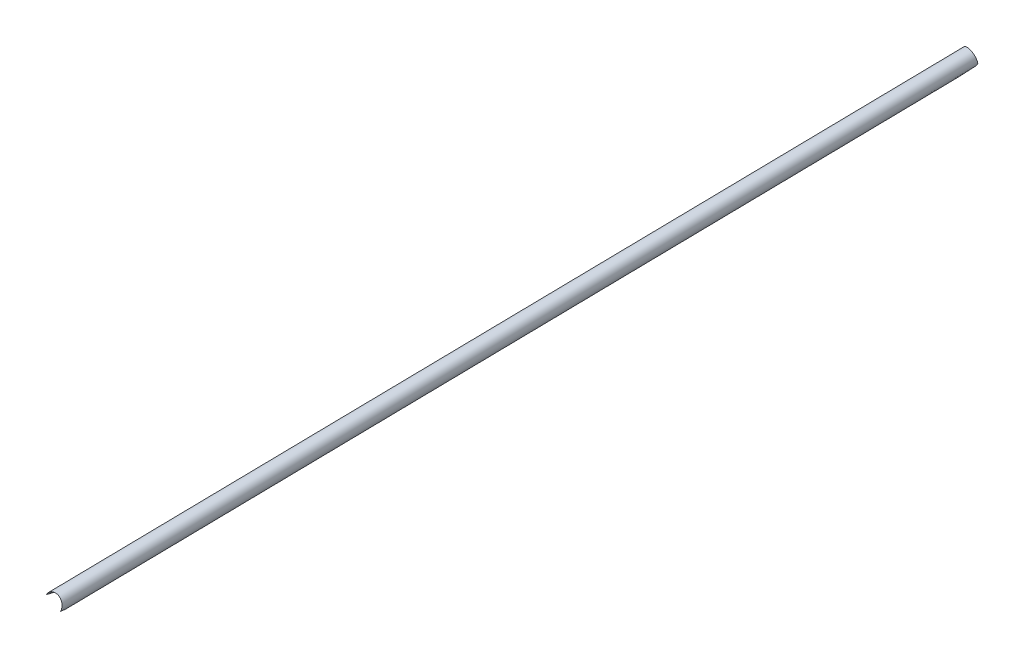
ISO-10303-21;
HEADER;
FILE_DESCRIPTION(('STEP AP214'),'2;1');
FILE_NAME('part.step','',(''),(''),'','','');
FILE_SCHEMA(('AUTOMOTIVE_DESIGN { 1 0 10303 214 1 1 1 1 }'));
ENDSEC;
DATA;
#1=APPLICATION_CONTEXT('core data for automotive mechanical design processes');
#2=APPLICATION_PROTOCOL_DEFINITION('international standard','automotive_design',2000,#1);
#3=PRODUCT_CONTEXT('',#1,'mechanical');
#4=PRODUCT('Part','Part','',(#3));
#5=PRODUCT_RELATED_PRODUCT_CATEGORY('part','',(#4));
#6=PRODUCT_DEFINITION_FORMATION('','',#4);
#7=PRODUCT_DEFINITION_CONTEXT('part definition',#1,'design');
#8=PRODUCT_DEFINITION('design','',#6,#7);
#9=PRODUCT_DEFINITION_SHAPE('','',#8);
#10=(LENGTH_UNIT() NAMED_UNIT(*) SI_UNIT(.MILLI.,.METRE.));
#11=(NAMED_UNIT(*) PLANE_ANGLE_UNIT() SI_UNIT($,.RADIAN.));
#12=(NAMED_UNIT(*) SI_UNIT($,.STERADIAN.) SOLID_ANGLE_UNIT());
#13=UNCERTAINTY_MEASURE_WITH_UNIT(LENGTH_MEASURE(1.E-05),#10,'distance_accuracy_value','');
#14=(GEOMETRIC_REPRESENTATION_CONTEXT(3) GLOBAL_UNCERTAINTY_ASSIGNED_CONTEXT((#13)) GLOBAL_UNIT_ASSIGNED_CONTEXT((#10,
#11,#12)) REPRESENTATION_CONTEXT('',''));
#15=CARTESIAN_POINT('',(0.,0.,0.));
#16=DIRECTION('',(0.,0.,1.));
#17=DIRECTION('',(1.,0.,0.));
#18=AXIS2_PLACEMENT_3D('',#15,#16,#17);
#19=CARTESIAN_POINT('',(325.000000000001,320.,-1580.));
#20=DIRECTION('',(-0.0876619818920292,-0.105194378270435,0.99058039537993));
#21=DIRECTION('',(0.,-0.994408591727349,-0.105600912395825));
#22=AXIS2_PLACEMENT_3D('',#19,#20,#21);
#23=CYLINDRICAL_SURFACE('',#22,9.79999999999998);
#24=CARTESIAN_POINT('',(227.524141759936,193.283765912995,-479.55769082875));
#25=CARTESIAN_POINT('',(227.679775034361,193.261769446244,-479.350571271817));
#26=CARTESIAN_POINT('',(227.829401668831,193.243848711683,-479.138457133615));
#27=CARTESIAN_POINT('',(228.118242825217,193.214861654862,-478.706755033853));
#28=CARTESIAN_POINT('',(228.257452096282,193.203798769096,-478.48716338333));
#29=CARTESIAN_POINT('',(228.526994124804,193.187530385751,-478.041888579146));
#30=CARTESIAN_POINT('',(228.657311081363,193.182335072134,-477.816195528511));
#31=CARTESIAN_POINT('',(228.909895418455,193.17706640093,-477.360364585562));
#32=CARTESIAN_POINT('',(229.03216406576,193.176992235361,-477.130227400146));
#33=CARTESIAN_POINT('',(229.270569601386,193.181380779396,-476.664479068794));
#34=CARTESIAN_POINT('',(229.386648236271,193.185880557803,-476.428838562916));
#35=CARTESIAN_POINT('',(229.612362827865,193.198994567431,-475.954613229065));
#36=CARTESIAN_POINT('',(229.721998601445,193.20760891554,-475.716028317633));
#37=CARTESIAN_POINT('',(230.042036624605,193.239013615948,-474.99715199172));
#38=CARTESIAN_POINT('',(230.243815348801,193.267371930423,-474.513250738814));
#39=CARTESIAN_POINT('',(230.644273421559,193.339644524923,-473.498695811283));
#40=CARTESIAN_POINT('',(230.841318238776,193.384650793075,-472.967483601151));
#41=CARTESIAN_POINT('',(231.216910130776,193.487952211434,-471.899758884969));
#42=CARTESIAN_POINT('',(231.395453380434,193.54625010169,-471.363245307896));
#43=CARTESIAN_POINT('',(231.73704634262,193.675443554417,-470.285969744561));
#44=CARTESIAN_POINT('',(231.900072994786,193.74635743117,-469.745202689347));
#45=CARTESIAN_POINT('',(232.212545786767,193.900631203537,-468.661599721764));
#46=CARTESIAN_POINT('',(232.361993263631,193.983989871658,-468.118764018578));
#47=CARTESIAN_POINT('',(232.648605096802,194.163425503198,-467.034320391272));
#48=CARTESIAN_POINT('',(232.785815858751,194.259450664699,-466.492716147638));
#49=CARTESIAN_POINT('',(233.050247017517,194.465971323462,-465.409741775708));
#50=CARTESIAN_POINT('',(233.177465982368,194.576468888794,-464.868371691988));
#51=CARTESIAN_POINT('',(233.423234631491,194.814420656716,-463.788201253249));
#52=CARTESIAN_POINT('',(233.541796649242,194.941849976373,-463.249398306688));
#53=CARTESIAN_POINT('',(233.714386622487,195.149285962632,-462.44435007202));
#54=CARTESIAN_POINT('',(233.771034846265,195.221137358805,-462.176557531623));
#55=CARTESIAN_POINT('',(233.882772952946,195.371167395193,-461.642429676321));
#56=CARTESIAN_POINT('',(233.937862919402,195.449345695281,-461.376094283904));
#57=CARTESIAN_POINT('',(234.051495862006,195.620409991222,-460.821870462524));
#58=CARTESIAN_POINT('',(234.109911321774,195.713985525557,-460.534167218048));
#59=CARTESIAN_POINT('',(234.225326576534,195.911894779358,-459.962097205291));
#60=CARTESIAN_POINT('',(234.282326091932,196.016230602945,-459.677731101726));
#61=CARTESIAN_POINT('',(234.394990620432,196.238177502834,-459.114060467562));
#62=CARTESIAN_POINT('',(234.450656207831,196.355782737084,-458.834753771856));
#63=CARTESIAN_POINT('',(234.560596814018,196.607704346444,-458.283480839578));
#64=CARTESIAN_POINT('',(234.614872336196,196.742014565877,-458.011511943768));
#65=CARTESIAN_POINT('',(234.703541399441,196.982926390315,-457.568375959304));
#66=CARTESIAN_POINT('',(234.738473418692,197.083620850974,-457.394114695474));
#67=CARTESIAN_POINT('',(234.807127746023,197.295738870772,-457.052022013399));
#68=CARTESIAN_POINT('',(234.840850454736,197.40715883074,-456.884188464441));
#69=CARTESIAN_POINT('',(234.906429195171,197.641952754429,-456.557212297807));
#70=CARTESIAN_POINT('',(234.938289088946,197.765300468914,-456.39805174923));
#71=CARTESIAN_POINT('',(234.999287652922,198.02533966927,-456.090443167226));
#72=CARTESIAN_POINT('',(235.028427201414,198.162026819013,-455.941991679811));
#73=CARTESIAN_POINT('',(235.077420376309,198.421451193061,-455.685867697626));
#74=CARTESIAN_POINT('',(235.097979103746,198.541756706167,-455.57586846344));
#75=CARTESIAN_POINT('',(235.135636326235,198.791214095324,-455.365771786737));
#76=CARTESIAN_POINT('',(235.152735669491,198.920363792457,-455.265671920086));
#77=CARTESIAN_POINT('',(235.182561760447,199.186811079664,-455.076369671742));
#78=CARTESIAN_POINT('',(235.195290535285,199.32410485764,-454.987162250369));
#79=CARTESIAN_POINT('',(235.215495508505,199.605799618624,-454.820087140679));
#80=CARTESIAN_POINT('',(235.222971461027,199.750200933966,-454.742219983284));
#81=CARTESIAN_POINT('',(235.231872432315,200.044232838304,-454.59801844109));
#82=CARTESIAN_POINT('',(235.233316968181,200.193844978288,-454.53164752488));
#83=CARTESIAN_POINT('',(235.229597139218,200.497265145354,-454.409593041406));
#84=CARTESIAN_POINT('',(235.224432712799,200.651073211526,-454.353909573745));
#85=CARTESIAN_POINT('',(235.207042866487,200.961745865543,-454.252256475382));
#86=CARTESIAN_POINT('',(235.194805401935,201.118615225067,-454.206303597724));
#87=CARTESIAN_POINT('',(235.162979279434,201.433932887679,-454.123148600958));
#88=CARTESIAN_POINT('',(235.143388698724,201.59238159319,-454.085948774825));
#89=CARTESIAN_POINT('',(235.085885970475,201.983182433493,-454.00373811593));
#90=CARTESIAN_POINT('',(235.04369066744,202.215829456721,-453.963069141364));
#91=CARTESIAN_POINT('',(234.943042656061,202.67952550978,-453.894727246042));
#92=CARTESIAN_POINT('',(234.884583378612,202.91057385517,-453.867059588753));
#93=CARTESIAN_POINT('',(234.751445828009,203.3691800742,-453.82186299056));
#94=CARTESIAN_POINT('',(234.676751953098,203.596734363187,-453.80434386236));
#95=CARTESIAN_POINT('',(234.511439395545,204.046412419294,-453.777152501069));
#96=CARTESIAN_POINT('',(234.420822441325,204.268536772844,-453.767479416943));
#97=CARTESIAN_POINT('',(234.221728702619,204.711037404841,-453.753946825999));
#98=CARTESIAN_POINT('',(234.1128858779,204.931253160141,-453.750227614313));
#99=CARTESIAN_POINT('',(233.879378728158,205.363157594568,-453.747442003996));
#100=CARTESIAN_POINT('',(233.754714135621,205.574846129437,-453.748375684047));
#101=CARTESIAN_POINT('',(233.490182698618,205.98836182909,-453.753628065838));
#102=CARTESIAN_POINT('',(233.350320750724,206.190192139982,-453.757945680048));
#103=CARTESIAN_POINT('',(233.056034014624,206.582875590182,-453.768957551839));
#104=CARTESIAN_POINT('',(232.901608692242,206.773728326425,-453.775651896622));
#105=CARTESIAN_POINT('',(232.559363874443,207.165775739938,-453.791521987868));
#106=CARTESIAN_POINT('',(232.369766118187,207.365414224952,-453.800900289909));
#107=CARTESIAN_POINT('',(231.974436981411,207.747986242138,-453.820749736871));
#108=CARTESIAN_POINT('',(231.768704326411,207.930918452223,-453.831220968144));
#109=CARTESIAN_POINT('',(231.342432327294,208.278745141926,-453.852593542151));
#110=CARTESIAN_POINT('',(231.121888667462,208.443634326939,-453.863495009866));
#111=CARTESIAN_POINT('',(230.667583799103,208.754063932163,-453.885243014702));
#112=CARTESIAN_POINT('',(230.433822915239,208.899604827343,-453.896089553166));
#113=CARTESIAN_POINT('',(229.95571333084,209.169699881993,-453.917369161467));
#114=CARTESIAN_POINT('',(229.711411535085,209.294336951699,-453.927803732892));
#115=CARTESIAN_POINT('',(229.213089262964,209.522427857574,-453.948147775425));
#116=CARTESIAN_POINT('',(228.959068757929,209.625881631251,-453.958057244984));
#117=CARTESIAN_POINT('',(228.443187344442,209.81085737675,-453.977342050796));
#118=CARTESIAN_POINT('',(228.181327578357,209.892382526971,-453.986717464301));
#119=CARTESIAN_POINT('',(227.651636167793,210.032973729451,-454.005082358819));
#120=CARTESIAN_POINT('',(227.383804550305,210.092039883193,-454.014071841576));
#121=CARTESIAN_POINT('',(226.845759539637,210.187065988969,-454.031922021318));
#122=CARTESIAN_POINT('',(226.575570642185,210.223164694476,-454.040783169401));
#123=CARTESIAN_POINT('',(226.033136646259,210.272658380318,-454.058918455622));
#124=CARTESIAN_POINT('',(225.76089154397,210.286053318524,-454.068192594526));
#125=CARTESIAN_POINT('',(225.216157443394,210.290150802338,-454.087852404459));
#126=CARTESIAN_POINT('',(224.943668390666,210.280843771539,-454.098238542797));
#127=CARTESIAN_POINT('',(224.400486997439,210.239698831492,-454.121066388616));
#128=CARTESIAN_POINT('',(224.129794640348,210.207861130604,-454.133508077086));
#129=CARTESIAN_POINT('',(223.588815762671,210.121474203502,-454.161881766833));
#130=CARTESIAN_POINT('',(223.318575139329,210.066650590012,-454.177854795197));
#131=CARTESIAN_POINT('',(222.783876986819,209.934802183401,-454.21493115014));
#132=CARTESIAN_POINT('',(222.519420191617,209.857774589987,-454.236035123764));
#133=CARTESIAN_POINT('',(221.998512550322,209.682315763628,-454.285643744742));
#134=CARTESIAN_POINT('',(221.742058889281,209.583892155601,-454.314145756351));
#135=CARTESIAN_POINT('',(221.239364741536,209.366697681635,-454.381529843779));
#136=CARTESIAN_POINT('',(220.993120492528,209.247934395424,-454.420408055836));
#137=CARTESIAN_POINT('',(220.584381926145,209.029572109673,-454.498784107786));
#138=CARTESIAN_POINT('',(220.418660567391,208.934696149569,-454.534696758261));
#139=CARTESIAN_POINT('',(220.094594609864,208.736439978464,-454.61519892794));
#140=CARTESIAN_POINT('',(219.936247945513,208.633062171455,-454.65978599919));
#141=CARTESIAN_POINT('',(219.628394286367,208.419073069985,-454.759316926573));
#142=CARTESIAN_POINT('',(219.478869908826,208.308476970275,-454.814239457996));
#143=CARTESIAN_POINT('',(219.189643208666,208.081319423351,-454.93631330477));
#144=CARTESIAN_POINT('',(219.049939005796,207.964759125518,-455.003462270257));
#145=CARTESIAN_POINT('',(218.802663899804,207.746090744805,-455.140011497678));
#146=CARTESIAN_POINT('',(218.693480530717,207.64456565986,-455.207425433438));
#147=CARTESIAN_POINT('',(218.483862240491,207.439996122096,-455.352737926746));
#148=CARTESIAN_POINT('',(218.383426132422,207.33695187764,-455.430635058151));
#149=CARTESIAN_POINT('',(218.191959354223,207.130886734897,-455.597079345038));
#150=CARTESIAN_POINT('',(218.100922550392,207.027865865724,-455.685619472519));
#151=CARTESIAN_POINT('',(217.928486542377,206.82321952238,-455.873088739158));
#152=CARTESIAN_POINT('',(217.847087658026,206.721594094617,-455.972018222882));
#153=CARTESIAN_POINT('',(217.694179627761,206.521367557198,-456.179067357192));
#154=CARTESIAN_POINT('',(217.622632963633,206.422756153531,-456.287149460789));
#155=CARTESIAN_POINT('',(217.488650923765,206.229021005543,-456.511725334923));
#156=CARTESIAN_POINT('',(217.426215779738,206.133897349964,-456.628219319266));
#157=CARTESIAN_POINT('',(217.309737002589,205.947557929359,-456.868473622203));
#158=CARTESIAN_POINT('',(217.255701146882,205.856345842208,-456.992240530855));
#159=CARTESIAN_POINT('',(217.155279015213,205.678092108662,-457.245706262639));
#160=CARTESIAN_POINT('',(217.108893304643,205.591050770848,-457.375405523304));
#161=CARTESIAN_POINT('',(216.980243991793,205.336759312936,-457.770661402009));
#162=CARTESIAN_POINT('',(216.908016229361,205.175563719492,-458.043398971639));
#163=CARTESIAN_POINT('',(216.7842042593,204.867172766928,-458.601219373826));
#164=CARTESIAN_POINT('',(216.732642915432,204.719993050352,-458.886315494806));
#165=CARTESIAN_POINT('',(216.645225625672,204.436075363806,-459.465965701449));
#166=CARTESIAN_POINT('',(216.609460278733,204.299401249701,-459.760564206849));
#167=CARTESIAN_POINT('',(216.565377337943,204.101045170718,-460.206187149407));
#168=CARTESIAN_POINT('',(216.552279061443,204.036049425768,-460.355315291101));
#169=CARTESIAN_POINT('',(216.528955252682,203.907984366024,-460.654621175976));
#170=CARTESIAN_POINT('',(216.518729696604,203.844915035261,-460.804798910444));
#171=CARTESIAN_POINT('',(216.492549792602,203.66245603233,-461.246331375199));
#172=CARTESIAN_POINT('',(216.480135939437,203.545348152884,-461.538840419423));
#173=CARTESIAN_POINT('',(216.463493235131,203.315861212623,-462.125956287699));
#174=CARTESIAN_POINT('',(216.45926555671,203.203482831593,-462.420563406247));
#175=CARTESIAN_POINT('',(216.457977456735,202.982245831493,-463.011265886178));
#176=CARTESIAN_POINT('',(216.460920511987,202.873388945785,-463.307361900008));
#177=CARTESIAN_POINT('',(216.473268692019,202.65832115127,-463.900387902338));
#178=CARTESIAN_POINT('',(216.482674146172,202.552110377615,-464.197317932576));
#179=CARTESIAN_POINT('',(216.507490215125,202.341343529476,-464.792326000479));
#180=CARTESIAN_POINT('',(216.522915391705,202.236792112102,-465.090405073227));
#181=CARTESIAN_POINT('',(216.559452944007,202.029008146948,-465.686677026974));
#182=CARTESIAN_POINT('',(216.580565469621,201.925775634003,-465.984869910766));
#183=CARTESIAN_POINT('',(216.65210131614,201.617355543918,-466.879019448965));
#184=CARTESIAN_POINT('',(216.710731822877,201.413373228345,-467.474753253026));
#185=CARTESIAN_POINT('',(216.849459581268,201.005561938792,-468.663584336174));
#186=CARTESIAN_POINT('',(216.929551262746,200.801732938764,-469.256682258847));
#187=CARTESIAN_POINT('',(217.112126627585,200.391720159928,-470.438744217529));
#188=CARTESIAN_POINT('',(217.214614318679,200.185535965927,-471.027707494156));
#189=CARTESIAN_POINT('',(217.443768244077,199.769159947617,-472.198064460517));
#190=CARTESIAN_POINT('',(217.570380910158,199.558977913961,-472.779471928368));
#191=CARTESIAN_POINT('',(217.781118430949,199.238843453368,-473.644596745298));
#192=CARTESIAN_POINT('',(217.854824531743,199.131334139651,-473.931775268712));
#193=CARTESIAN_POINT('',(218.009803105017,198.914399267912,-474.50334575239));
#194=CARTESIAN_POINT('',(218.091075033678,198.804973848074,-474.787737911313));
#195=CARTESIAN_POINT('',(218.232857638988,198.621520740394,-475.256922078837));
#196=CARTESIAN_POINT('',(218.29102035651,198.548120689211,-475.442670459614));
#197=CARTESIAN_POINT('',(218.411229340551,198.400256954869,-475.812474485533));
#198=CARTESIAN_POINT('',(218.473275540845,198.325793289865,-475.99653015948));
#199=CARTESIAN_POINT('',(218.665734351604,198.100587265372,-476.545957430588));
#200=CARTESIAN_POINT('',(218.802424147984,197.948085961889,-476.908445073456));
#201=CARTESIAN_POINT('',(219.094885549083,197.638188241206,-477.621359823902));
#202=CARTESIAN_POINT('',(219.250565480432,197.480817879831,-477.971835169694));
#203=CARTESIAN_POINT('',(219.501858302872,197.239859375124,-478.486412978259));
#204=CARTESIAN_POINT('',(219.588559813533,197.158744498504,-478.65604027362));
#205=CARTESIAN_POINT('',(219.768593489932,196.994713222332,-478.990836453052));
#206=CARTESIAN_POINT('',(219.86192463851,196.911797100488,-479.156006015712));
#207=CARTESIAN_POINT('',(220.037648333683,196.759890370175,-479.45014955372));
#208=CARTESIAN_POINT('',(220.118767121726,196.691234891613,-479.580056627946));
#209=CARTESIAN_POINT('',(220.286393741956,196.552558557006,-479.835608726405));
#210=CARTESIAN_POINT('',(220.372901480959,196.482537724585,-479.961253824276));
#211=CARTESIAN_POINT('',(220.552119570036,196.340870302266,-480.207752146178));
#212=CARTESIAN_POINT('',(220.64484622853,196.269219791563,-480.328591332825));
#213=CARTESIAN_POINT('',(220.836906185257,196.124455502558,-480.563967122118));
#214=CARTESIAN_POINT('',(220.936238585724,196.051341924037,-480.678504577363));
#215=CARTESIAN_POINT('',(221.143672370431,195.902611924052,-480.901400169567));
#216=CARTESIAN_POINT('',(221.251876077059,195.826974868912,-481.009650866839));
#217=CARTESIAN_POINT('',(221.476444568078,195.674358719307,-481.216217496506));
#218=CARTESIAN_POINT('',(221.592811481786,195.597379278654,-481.314530820362));
#219=CARTESIAN_POINT('',(221.95439821858,195.365337878746,-481.59016194099));
#220=CARTESIAN_POINT('',(222.213297403154,195.208300101032,-481.749526641125));
#221=CARTESIAN_POINT('',(222.650195156823,194.961488965708,-481.94186812021));
#222=CARTESIAN_POINT('',(222.816816162602,194.871017571062,-481.999832312171));
#223=CARTESIAN_POINT('',(223.159404452497,194.69312761605,-482.084675551231));
#224=CARTESIAN_POINT('',(223.335361054912,194.605705748573,-482.111589356458));
#225=CARTESIAN_POINT('',(223.692880069974,194.436443506236,-482.130863739669));
#226=CARTESIAN_POINT('',(223.874464533212,194.354630635442,-482.123064915843));
#227=CARTESIAN_POINT('',(224.236543385254,194.199684244672,-482.072859397221));
#228=CARTESIAN_POINT('',(224.417037115605,194.126555550152,-482.030433563678));
#229=CARTESIAN_POINT('',(224.803518467183,193.978234269636,-481.90467605378));
#230=CARTESIAN_POINT('',(225.00829232987,193.905011642795,-481.815385568377));
#231=CARTESIAN_POINT('',(225.404928200263,193.772388169522,-481.603727858632));
#232=CARTESIAN_POINT('',(225.596757610755,193.713021354866,-481.481280756341));
#233=CARTESIAN_POINT('',(225.929369587274,193.617249744434,-481.239043856035));
#234=CARTESIAN_POINT('',(226.072726029193,193.57862618396,-481.123552029051));
#235=CARTESIAN_POINT('',(226.350752650034,193.508314532853,-480.880496343656));
#236=CARTESIAN_POINT('',(226.485416295385,193.476631617019,-480.752923578764));
#237=CARTESIAN_POINT('',(226.746606567664,193.419311203036,-480.488472819071));
#238=CARTESIAN_POINT('',(226.873131448236,193.393674999218,-480.351592840075));
#239=CARTESIAN_POINT('',(227.118732708703,193.347654954899,-480.070605151609));
#240=CARTESIAN_POINT('',(227.237812391752,193.327268772457,-479.926500699241));
#241=CARTESIAN_POINT('',(227.382397033106,193.304653544503,-479.742884508715));
#242=CARTESIAN_POINT('',(227.411043201572,193.300282275773,-479.706062429139));
#243=CARTESIAN_POINT('',(227.467904815877,193.291818776119,-479.632110928121));
#244=CARTESIAN_POINT('',(227.496120644982,193.287726284102,-479.594981831818));
#245=CARTESIAN_POINT('',(227.524141759936,193.283765912995,-479.55769082875));
#246=B_SPLINE_CURVE_WITH_KNOTS('',3,(#24,#25,#26,#27,#28,#29,#30,#31,#32,#33,#34,#35,#36,#37,
#38,#39,#40,#41,#42,#43,#44,#45,#46,#47,#48,#49,#50,#51,#52,#53,#54,#55,#56,#57,#58,#59,#60,#61,
#62,#63,#64,#65,#66,#67,#68,#69,#70,#71,#72,#73,#74,#75,#76,#77,#78,#79,#80,#81,#82,#83,#84,#85,
#86,#87,#88,#89,#90,#91,#92,#93,#94,#95,#96,#97,#98,#99,#100,#101,#102,#103,#104,#105,#106,#107,
#108,#109,#110,#111,#112,#113,#114,#115,#116,#117,#118,#119,#120,#121,#122,#123,#124,#125,#126,
#127,#128,#129,#130,#131,#132,#133,#134,#135,#136,#137,#138,#139,#140,#141,#142,#143,#144,#145,
#146,#147,#148,#149,#150,#151,#152,#153,#154,#155,#156,#157,#158,#159,#160,#161,#162,#163,#164,
#165,#166,#167,#168,#169,#170,#171,#172,#173,#174,#175,#176,#177,#178,#179,#180,#181,#182,#183,
#184,#185,#186,#187,#188,#189,#190,#191,#192,#193,#194,#195,#196,#197,#198,#199,#200,#201,#202,
#203,#204,#205,#206,#207,#208,#209,#210,#211,#212,#213,#214,#215,#216,#217,#218,#219,#220,#221,
#222,#223,#224,#225,#226,#227,#228,#229,#230,#231,#232,#233,#234,#235,#236,#237,#238,#239,#240,
#241,#242,#243,#244,#245),.UNSPECIFIED.,.T.,.F.,(4,2,2,2,2,2,2,2,2,2,2,2,2,2,2,2,2,2,2,2,2,2,2,
2,2,2,2,2,2,2,2,2,2,2,2,2,2,2,2,2,2,2,2,2,2,2,2,2,2,2,2,2,2,2,2,2,2,2,2,2,2,2,2,2,2,2,2,2,2,2,2,
2,2,2,2,2,2,2,2,2,2,2,2,2,2,2,2,2,2,2,2,2,2,2,2,2,2,2,2,2,2,2,2,2,2,2,2,2,2,2,4),(0.,
0.780002680383042,1.5603959077036,2.34214154109019,3.12376383526517,3.91177156716387,
4.69980168626434,6.27422445078024,7.97877381586341,9.68367488954446,11.391071422368,
13.0982996570223,14.7987506448551,16.4994448886306,18.1976668763301,19.046581204171,
19.8954499258031,20.8196626471862,21.7440564376334,22.6680448266029,23.591693735204,
24.2041984211269,24.8164982797491,25.4274800640749,26.0382638995183,26.5306551294795,
27.0229254837151,27.5149672058869,28.0070319567388,28.4975031921073,28.9879789982927,
29.4792925058011,29.9707345762047,30.6894163728863,31.4083888713861,32.1280553955155,
32.8476438492742,33.5839513091138,34.3202712200652,35.0563545890317,35.7924649676462,
36.6179171374726,37.4434345746773,38.2691936084437,39.0949323673794,39.9173143270711,
40.7396987128317,41.5619638354963,42.3842252426153,43.2014707268077,44.0187177274703,
44.836309528286,45.6538937682584,46.4815287852697,47.3092682265569,48.1367131677316,
48.9638504239307,49.5463151674111,50.1286157749937,50.7097278641735,51.2907283840227,
51.7810681175642,52.2713412121884,52.7612923200338,53.2512596823276,53.7393063065256,
54.2273653399665,54.715873639041,55.2044180257,56.1774261286514,57.1515077423221,
58.1311059230803,58.6206864973741,59.1102630123638,60.0560354188967,61.0019433031702,
61.9483099119497,62.8947247582756,63.8434433276696,64.7921869030204,66.6890182892559,
68.5853578352611,70.4820370067323,72.3745527725063,73.3205971304492,74.2665735407602,
74.8905960872307,75.5146079949882,76.7631131734435,78.0058135766611,78.6268400548293,
79.2477714562271,79.7511615156624,80.2545428730414,80.7593002208168,81.2639891081362,
81.7756617440202,82.2874683460233,83.3051243314358,83.8977147486227,84.4896411682936,
85.0842885354459,85.6792647937965,86.3806499633373,87.083740116038,87.6472553288096,
88.2111892674453,88.7752438098851,89.3390463001794,89.4796160107615,89.6200522050922),.UNSPECIFIED.);
#247=CARTESIAN_POINT('',(227.524141759936,193.283765912995,-479.55769082875));
#248=VERTEX_POINT('',#247);
#249=EDGE_CURVE('E100',#248,#248,#246,.T.);
#250=ORIENTED_EDGE('',*,*,#249,.T.);
#251=EDGE_LOOP('',(#250));
#252=FACE_BOUND('',#251,.T.);
#253=CARTESIAN_POINT('',(319.707850865871,303.904216840116,-1521.23360372581));
#254=CARTESIAN_POINT('',(319.635570725729,303.88978877866,-1521.09773258442));
#255=CARTESIAN_POINT('',(319.562302757825,303.875962147966,-1520.96232406513));
#256=CARTESIAN_POINT('',(319.413570804102,303.849656169405,-1520.69257713832));
#257=CARTESIAN_POINT('',(319.338106730107,303.83717687573,-1520.55823877404));
#258=CARTESIAN_POINT('',(319.184683578811,303.813725921501,-1520.29072261696));
#259=CARTESIAN_POINT('',(319.106722705868,303.802755377451,-1520.15754575121));
#260=CARTESIAN_POINT('',(318.948058956911,303.782550392221,-1519.89271175931));
#261=CARTESIAN_POINT('',(318.867356071046,303.773315957278,-1519.76105463861));
#262=CARTESIAN_POINT('',(318.62070330947,303.7485831629,-1519.3688936153));
#263=CARTESIAN_POINT('',(318.450114003171,303.736040031387,-1519.11103172388));
#264=CARTESIAN_POINT('',(318.182156582079,303.725439281571,-1518.73274644597));
#265=CARTESIAN_POINT('',(318.090867551748,303.723273847647,-1518.60812167106));
#266=CARTESIAN_POINT('',(317.903538010208,303.722263997233,-1518.36249792008));
#267=CARTESIAN_POINT('',(317.807498773365,303.723418694729,-1518.24149798539));
#268=CARTESIAN_POINT('',(317.62393380992,303.729354572786,-1518.02122297919));
#269=CARTESIAN_POINT('',(317.537153672779,303.733593738636,-1517.92131497863));
#270=CARTESIAN_POINT('',(317.358828427667,303.745724980086,-1517.72611404883));
#271=CARTESIAN_POINT('',(317.267285456783,303.753615429688,-1517.63081908616));
#272=CARTESIAN_POINT('',(317.079017904674,303.773875043781,-1517.4467571315));
#273=CARTESIAN_POINT('',(316.982316853553,303.786225142026,-1517.35796425636));
#274=CARTESIAN_POINT('',(316.782646777068,303.816542948819,-1517.18888105853));
#275=CARTESIAN_POINT('',(316.679685897866,303.834503477184,-1517.10858004288));
#276=CARTESIAN_POINT('',(316.481260069771,303.874598014198,-1516.9700623762));
#277=CARTESIAN_POINT('',(316.386689258602,303.895828164857,-1516.91032740656));
#278=CARTESIAN_POINT('',(316.192244112012,303.944716947203,-1516.80303567285));
#279=CARTESIAN_POINT('',(316.092368941303,303.972376593685,-1516.75548083371));
#280=CARTESIAN_POINT('',(315.886912644554,304.035550996557,-1516.67626645382));
#281=CARTESIAN_POINT('',(315.781271849138,304.071168759604,-1516.64483501797));
#282=CARTESIAN_POINT('',(315.568757284951,304.1501951079,-1516.6034886007));
#283=CARTESIAN_POINT('',(315.461887113232,304.193584655508,-1516.59352179991));
#284=CARTESIAN_POINT('',(315.264506768223,304.281070149299,-1516.59692149276));
#285=CARTESIAN_POINT('',(315.173609182773,304.324413617483,-1516.6075520463));
#286=CARTESIAN_POINT('',(314.997190033514,304.414474517174,-1516.64580312856));
#287=CARTESIAN_POINT('',(314.91167504897,304.461195933355,-1516.67344402128));
#288=CARTESIAN_POINT('',(314.726224907824,304.568825085942,-1516.75210047124));
#289=CARTESIAN_POINT('',(314.628410133643,304.630232864168,-1516.80735106544));
#290=CARTESIAN_POINT('',(314.444436577262,304.753478508842,-1516.93424365995));
#291=CARTESIAN_POINT('',(314.358303922459,304.815317024414,-1517.00592146834));
#292=CARTESIAN_POINT('',(314.205164203555,304.931657182501,-1517.15231218815));
#293=CARTESIAN_POINT('',(314.137096930698,304.98623668876,-1517.22588222279));
#294=CARTESIAN_POINT('',(314.008064478171,305.094531926659,-1517.37965586795));
#295=CARTESIAN_POINT('',(313.947105540193,305.148246863997,-1517.45986520422));
#296=CARTESIAN_POINT('',(313.831118925508,305.25479660297,-1517.62534567551));
#297=CARTESIAN_POINT('',(313.776106376213,305.307628883595,-1517.71062890261));
#298=CARTESIAN_POINT('',(313.671281638889,305.412260866792,-1517.8848535716));
#299=CARTESIAN_POINT('',(313.621467486405,305.464060953396,-1517.97379361375));
#300=CARTESIAN_POINT('',(313.496945397935,305.598280394643,-1518.21011260069));
#301=CARTESIAN_POINT('',(313.425773654339,305.679934043054,-1518.35978524294));
#302=CARTESIAN_POINT('',(313.292447414747,305.841059385958,-1518.66427465473));
#303=CARTESIAN_POINT('',(313.230298203102,305.920529779843,-1518.81909437412));
#304=CARTESIAN_POINT('',(313.113217742686,306.077685370633,-1519.13271337781));
#305=CARTESIAN_POINT('',(313.0583004802,306.155366875389,-1519.2915196861));
#306=CARTESIAN_POINT('',(312.95453847794,306.309043221122,-1519.61191279084));
#307=CARTESIAN_POINT('',(312.905694475046,306.385037856511,-1519.77349992197));
#308=CARTESIAN_POINT('',(312.812872908612,306.535952106705,-1520.09969657391));
#309=CARTESIAN_POINT('',(312.768923399109,306.610863576793,-1520.26431778611));
#310=CARTESIAN_POINT('',(312.685448639699,306.759363732667,-1520.59527113561));
#311=CARTESIAN_POINT('',(312.645923588906,306.832952358796,-1520.76160334954));
#312=CARTESIAN_POINT('',(312.570761262848,306.97885417347,-1521.09541979947));
#313=CARTESIAN_POINT('',(312.535118879306,307.051168930304,-1521.26290220591));
#314=CARTESIAN_POINT('',(312.467200638133,307.194741917911,-1521.5989873475));
#315=CARTESIAN_POINT('',(312.434924678916,307.26600018051,-1521.76759004867));
#316=CARTESIAN_POINT('',(312.33282469297,307.500711865643,-1522.32818543606));
#317=CARTESIAN_POINT('',(312.26947179809,307.662111068951,-1522.72222382937));
#318=CARTESIAN_POINT('',(312.155200394212,307.980863203352,-1523.51374914337));
#319=CARTESIAN_POINT('',(312.104284078433,308.138215416378,-1523.91123665955));
#320=CARTESIAN_POINT('',(312.012567590771,308.449648913265,-1524.70889825183));
#321=CARTESIAN_POINT('',(311.971773081031,308.603728322453,-1525.1090737036));
#322=CARTESIAN_POINT('',(311.898673972836,308.909064193581,-1525.91127562815));
#323=CARTESIAN_POINT('',(311.866369679517,309.060320553881,-1526.31330216692));
#324=CARTESIAN_POINT('',(311.808953698327,309.360785877187,-1527.11975160306));
#325=CARTESIAN_POINT('',(311.783859814533,309.509988920597,-1527.52417795768));
#326=CARTESIAN_POINT('',(311.740033445399,309.806297072239,-1528.33414171259));
#327=CARTESIAN_POINT('',(311.72130104994,309.953402150801,-1528.7396791285));
#328=CARTESIAN_POINT('',(311.673513799101,310.391885221362,-1529.95732330858));
#329=CARTESIAN_POINT('',(311.652849793371,310.680536459192,-1530.77074638182));
#330=CARTESIAN_POINT('',(311.629648528181,311.25210180705,-1532.39950035607));
#331=CARTESIAN_POINT('',(311.627105010744,311.535017864082,-1533.21483050115));
#332=CARTESIAN_POINT('',(311.637344313301,312.096459616381,-1534.84696392878));
#333=CARTESIAN_POINT('',(311.650128318792,312.374984970363,-1535.66376732041));
#334=CARTESIAN_POINT('',(311.689042248591,312.928248240818,-1537.29712835258));
#335=CARTESIAN_POINT('',(311.715154598511,313.202990656686,-1538.1136849035));
#336=CARTESIAN_POINT('',(311.779346324067,313.749911909847,-1539.74715691766));
#337=CARTESIAN_POINT('',(311.81742538295,314.022090814799,-1540.56407237083));
#338=CARTESIAN_POINT('',(311.896403834374,314.513643436849,-1542.04416602515));
#339=CARTESIAN_POINT('',(311.935424106723,314.733315871894,-1542.70734661913));
#340=CARTESIAN_POINT('',(312.02039124106,315.171941791656,-1544.03350522829));
#341=CARTESIAN_POINT('',(312.066338136796,315.390895272866,-1544.69648324247));
#342=CARTESIAN_POINT('',(312.164962575467,315.828614707627,-1546.02224786567));
#343=CARTESIAN_POINT('',(312.217642374169,316.047380573477,-1546.68503433559));
#344=CARTESIAN_POINT('',(312.329639683762,316.485159973331,-1548.00996433559));
#345=CARTESIAN_POINT('',(312.38895719296,316.704173507273,-1548.67210786583));
#346=CARTESIAN_POINT('',(312.514207317884,317.142752175707,-1549.99463051954));
#347=CARTESIAN_POINT('',(312.580131295093,317.362316233131,-1550.65501081728));
#348=CARTESIAN_POINT('',(312.718878116189,317.802975789486,-1551.97453038914));
#349=CARTESIAN_POINT('',(312.791700902545,318.024071275632,-1552.63366967357));
#350=CARTESIAN_POINT('',(312.944660128225,318.468626658256,-1553.95018022845));
#351=CARTESIAN_POINT('',(313.024795351511,318.692086156161,-1554.60755177423));
#352=CARTESIAN_POINT('',(313.193093905095,319.142510025902,-1555.92005687252));
#353=CARTESIAN_POINT('',(313.281257091725,319.369474334956,-1556.57519046487));
#354=CARTESIAN_POINT('',(313.467199257074,319.829540924868,-1557.88575651027));
#355=CARTESIAN_POINT('',(313.565024960912,320.062668596262,-1558.54117346382));
#356=CARTESIAN_POINT('',(313.771665724271,320.53596777482,-1559.84784456952));
#357=CARTESIAN_POINT('',(313.880482074618,320.776140107008,-1560.49909822312));
#358=CARTESIAN_POINT('',(314.054076987749,321.143817991922,-1561.47148672192));
#359=CARTESIAN_POINT('',(314.11368461722,321.267641919418,-1561.79493824781));
#360=CARTESIAN_POINT('',(314.236868145583,321.518213770471,-1562.43994425279));
#361=CARTESIAN_POINT('',(314.300443953493,321.644961626946,-1562.7614987752));
#362=CARTESIAN_POINT('',(314.432186030206,321.901897487814,-1563.40222182559));
#363=CARTESIAN_POINT('',(314.500351465264,322.032084864793,-1563.7213907753));
#364=CARTESIAN_POINT('',(314.642108707298,322.296562813631,-1564.35680118727));
#365=CARTESIAN_POINT('',(314.715700283044,322.430853210502,-1564.67304277362));
#366=CARTESIAN_POINT('',(314.880490475969,322.724072240242,-1565.34728067929));
#367=CARTESIAN_POINT('',(314.972696617971,322.883756763169,-1565.7047062404));
#368=CARTESIAN_POINT('',(315.1677705813,323.210842390252,-1566.41300977896));
#369=CARTESIAN_POINT('',(315.270636472296,323.378242094259,-1566.76388892834));
#370=CARTESIAN_POINT('',(315.490038019544,323.722384543407,-1567.45679997366));
#371=CARTESIAN_POINT('',(315.606573402018,323.899127101385,-1567.79883204662));
#372=CARTESIAN_POINT('',(315.794705538311,324.172411693902,-1568.30240241074));
#373=CARTESIAN_POINT('',(315.859630170701,324.264858115801,-1568.46866244862));
#374=CARTESIAN_POINT('',(315.994590523572,324.4526578521,-1568.79741593954));
#375=CARTESIAN_POINT('',(316.064625853992,324.548010944333,-1568.95990967879));
#376=CARTESIAN_POINT('',(316.23338562719,324.772098141301,-1569.33059373875));
#377=CARTESIAN_POINT('',(316.334228111385,324.901938231732,-1569.53716641132));
#378=CARTESIAN_POINT('',(316.547897077296,325.166946853037,-1569.94054734682));
#379=CARTESIAN_POINT('',(316.660723980456,325.302115571192,-1570.13735526599));
#380=CARTESIAN_POINT('',(316.900149314242,325.577035180079,-1570.51821952739));
#381=CARTESIAN_POINT('',(317.026713770419,325.716774195255,-1570.70230556478));
#382=CARTESIAN_POINT('',(317.295844029283,325.999971338422,-1571.05533067259));
#383=CARTESIAN_POINT('',(317.438404608588,326.143428240674,-1571.22427465528));
#384=CARTESIAN_POINT('',(317.710429428114,326.402649257606,-1571.51168662619));
#385=CARTESIAN_POINT('',(317.836687712456,326.518130293752,-1571.63344337562));
#386=CARTESIAN_POINT('',(318.100829072601,326.74849389966,-1571.86422291848));
#387=CARTESIAN_POINT('',(318.238709297569,326.863376608891,-1571.97324881919));
#388=CARTESIAN_POINT('',(318.526099033758,327.090620673145,-1572.17770477267));
#389=CARTESIAN_POINT('',(318.675606333731,327.20298250238,-1572.27313740091));
#390=CARTESIAN_POINT('',(318.985815461739,327.423098119866,-1572.45013723127));
#391=CARTESIAN_POINT('',(319.146517618258,327.530851772753,-1572.5317040263));
#392=CARTESIAN_POINT('',(319.478170538414,327.739613146433,-1572.68125595669));
#393=CARTESIAN_POINT('',(319.649116997471,327.840623663445,-1572.74924674528));
#394=CARTESIAN_POINT('',(320.000174902183,328.034071217866,-1572.87255019039));
#395=CARTESIAN_POINT('',(320.180286605577,328.126508013963,-1572.92786249011));
#396=CARTESIAN_POINT('',(320.548575060067,328.301333265299,-1573.02709254289));
#397=CARTESIAN_POINT('',(320.736759920923,328.383711280874,-1573.07099851008));
#398=CARTESIAN_POINT('',(321.119711453532,328.53709166606,-1573.14877272321));
#399=CARTESIAN_POINT('',(321.314478361781,328.608093626396,-1573.18264060804));
#400=CARTESIAN_POINT('',(321.715376799182,328.739810331064,-1573.24271209756));
#401=CARTESIAN_POINT('',(321.921673666498,328.800142591216,-1573.26864865635));
#402=CARTESIAN_POINT('',(322.338579954896,328.907072753849,-1573.31294279565));
#403=CARTESIAN_POINT('',(322.549189394413,328.953670597609,-1573.33130034375));
#404=CARTESIAN_POINT('',(322.9734948025,329.032680239552,-1573.36181857873));
#405=CARTESIAN_POINT('',(323.187190877588,329.065091546953,-1573.37397905121));
#406=CARTESIAN_POINT('',(323.616512517013,329.11545465364,-1573.39330860195));
#407=CARTESIAN_POINT('',(323.832138275053,329.133404984471,-1573.4004771733));
#408=CARTESIAN_POINT('',(324.296810862923,329.156309219282,-1573.41163488385));
#409=CARTESIAN_POINT('',(324.54599266456,329.158894211141,-1573.41498130049));
#410=CARTESIAN_POINT('',(325.043830985702,329.144685995131,-1573.41771823152));
#411=CARTESIAN_POINT('',(325.29248745925,329.127891156959,-1573.41710841309));
#412=CARTESIAN_POINT('',(325.787821207848,329.075030188487,-1573.41294916339));
#413=CARTESIAN_POINT('',(326.034497629309,329.038956156982,-1573.40939852656));
#414=CARTESIAN_POINT('',(326.524264439074,328.947778269237,-1573.40013271614));
#415=CARTESIAN_POINT('',(326.767354757849,328.892674044539,-1573.39441750064));
#416=CARTESIAN_POINT('',(327.265235430579,328.759305125987,-1573.3809278231));
#417=CARTESIAN_POINT('',(327.519663575256,328.679696123012,-1573.37303778213));
#418=CARTESIAN_POINT('',(328.021012007471,328.49967957364,-1573.3558500089));
#419=CARTESIAN_POINT('',(328.267931912455,328.39927096951,-1573.34655220506));
#420=CARTESIAN_POINT('',(328.752577413218,328.1783469575,-1573.3267265216));
#421=CARTESIAN_POINT('',(328.990302383557,328.057830184814,-1573.3161985585));
#422=CARTESIAN_POINT('',(329.454888190999,327.797520820855,-1573.29384728169));
#423=CARTESIAN_POINT('',(329.68174906407,327.657728293407,-1573.28202397227));
#424=CARTESIAN_POINT('',(330.126240751498,327.357637005837,-1573.25658121622));
#425=CARTESIAN_POINT('',(330.343687966008,327.197068152541,-1573.24293802205));
#426=CARTESIAN_POINT('',(330.764142108248,326.858198291284,-1573.21338296598));
#427=CARTESIAN_POINT('',(330.967148745441,326.679896926725,-1573.19747105845));
#428=CARTESIAN_POINT('',(331.357247045347,326.306777354372,-1573.1624511188));
#429=CARTESIAN_POINT('',(331.544331836062,326.111952086431,-1573.14334171705));
#430=CARTESIAN_POINT('',(331.900996509377,325.707333025995,-1573.10066286743));
#431=CARTESIAN_POINT('',(332.070576686213,325.497539485202,-1573.07709349454));
#432=CARTESIAN_POINT('',(332.388717784861,325.067545146657,-1573.02418460499));
#433=CARTESIAN_POINT('',(332.537525846246,324.84751754064,-1572.99492506478));
#434=CARTESIAN_POINT('',(332.815478972638,324.396484543946,-1572.92843919409));
#435=CARTESIAN_POINT('',(332.944623625932,324.165478923544,-1572.89121269684));
#436=CARTESIAN_POINT('',(333.182039389667,323.695050459465,-1572.80641823931));
#437=CARTESIAN_POINT('',(333.290330053616,323.455635752042,-1572.75886005636));
#438=CARTESIAN_POINT('',(333.485343383744,322.971037464236,-1572.65062996332));
#439=CARTESIAN_POINT('',(333.572068896705,322.725854649974,-1572.58995978611));
#440=CARTESIAN_POINT('',(333.717300882653,322.253522684551,-1572.45829270272));
#441=CARTESIAN_POINT('',(333.777546182009,322.026556195929,-1572.38856219671));
#442=CARTESIAN_POINT('',(333.879724467965,321.573791175282,-1572.23358507348));
#443=CARTESIAN_POINT('',(333.921659737867,321.3479925011,-1572.1483403928));
#444=CARTESIAN_POINT('',(333.987957184617,320.901277465699,-1571.96097865224));
#445=CARTESIAN_POINT('',(334.012347423841,320.680353858235,-1571.85888885828));
#446=CARTESIAN_POINT('',(334.045137872772,320.246290887093,-1571.63714300444));
#447=CARTESIAN_POINT('',(334.053539605478,320.033150783888,-1571.51748861887));
#448=CARTESIAN_POINT('',(334.056224471072,319.64852969751,-1571.28035011642));
#449=CARTESIAN_POINT('',(334.052434805946,319.47559252671,-1571.16522818115));
#450=CARTESIAN_POINT('',(334.036295073924,319.138398000499,-1570.92351885314));
#451=CARTESIAN_POINT('',(334.023945992691,318.97413964802,-1570.79693278203));
#452=CARTESIAN_POINT('',(333.992184503643,318.654761112768,-1570.53339386998));
#453=CARTESIAN_POINT('',(333.9727677451,318.499646627274,-1570.39643468476));
#454=CARTESIAN_POINT('',(333.928280501339,318.198696121939,-1570.11354102069));
#455=CARTESIAN_POINT('',(333.90320927473,318.052861322033,-1569.9676053667));
#456=CARTESIAN_POINT('',(333.850879986564,317.781754464261,-1569.68039815292));
#457=CARTESIAN_POINT('',(333.82396974063,317.655776810155,-1569.53972515247));
#458=CARTESIAN_POINT('',(333.767205008403,317.410907681539,-1569.25288413743));
#459=CARTESIAN_POINT('',(333.737349948201,317.292017595585,-1569.10671505516));
#460=CARTESIAN_POINT('',(333.675323061144,317.06073356661,-1568.8096544777));
#461=CARTESIAN_POINT('',(333.643149652568,316.948344154825,-1568.65875979885));
#462=CARTESIAN_POINT('',(333.577013067866,316.729564444143,-1568.3530603522));
#463=CARTESIAN_POINT('',(333.543049750988,316.623174618398,-1568.1982552774));
#464=CARTESIAN_POINT('',(333.473577201534,316.415360356071,-1567.88464894593));
#465=CARTESIAN_POINT('',(333.438061636913,316.313960720562,-1567.72583270887));
#466=CARTESIAN_POINT('',(333.365941020116,316.116098317359,-1567.40540294323));
#467=CARTESIAN_POINT('',(333.329335953508,316.019635615111,-1567.24378937761));
#468=CARTESIAN_POINT('',(333.255294249502,315.831189390114,-1566.91827903119));
#469=CARTESIAN_POINT('',(333.217858044293,315.739203615303,-1566.75438345282));
#470=CARTESIAN_POINT('',(333.142316951433,315.559210441585,-1566.42458890339));
#471=CARTESIAN_POINT('',(333.104212086367,315.471202908671,-1566.25869000006));
#472=CARTESIAN_POINT('',(332.98119763772,315.19473147545,-1565.72405123391));
#473=CARTESIAN_POINT('',(332.89526637182,315.013127744103,-1565.35199078734));
#474=CARTESIAN_POINT('',(332.721777376978,314.663559308057,-1564.60185975825));
#475=CARTESIAN_POINT('',(332.634219284472,314.49559769826,-1564.22378783507));
#476=CARTESIAN_POINT('',(332.457896954759,314.170516319496,-1563.46296907822));
#477=CARTESIAN_POINT('',(332.369131886665,314.013404524367,-1563.08021904458));
#478=CARTESIAN_POINT('',(332.190691909299,313.708090958843,-1562.31138773887));
#479=CARTESIAN_POINT('',(332.10101695572,313.559889624803,-1561.92530630472));
#480=CARTESIAN_POINT('',(331.920608041487,313.270431565313,-1561.14951663989));
#481=CARTESIAN_POINT('',(331.829871822574,313.129195392156,-1560.75980129137));
#482=CARTESIAN_POINT('',(331.647608970435,312.852907310567,-1559.97836878714));
#483=CARTESIAN_POINT('',(331.556082324253,312.717855503736,-1559.58665159867));
#484=CARTESIAN_POINT('',(331.28037270374,312.320629624431,-1558.40950020095));
#485=CARTESIAN_POINT('',(331.094978890051,312.066256718228,-1557.62171627316));
#486=CARTESIAN_POINT('',(330.719333360372,311.571408375233,-1556.03701612636));
#487=CARTESIAN_POINT('',(330.529057718775,311.331035308078,-1555.24007391873));
#488=CARTESIAN_POINT('',(330.144249742703,310.862643035256,-1553.64350956818));
#489=CARTESIAN_POINT('',(329.949716986903,310.634625060202,-1552.84388716669));
#490=CARTESIAN_POINT('',(329.556234712219,310.189240339055,-1551.24470497743));
#491=CARTESIAN_POINT('',(329.357295451091,309.971852000386,-1550.44514866339));
#492=CARTESIAN_POINT('',(328.953973295189,309.545784593088,-1548.84508695541));
#493=CARTESIAN_POINT('',(328.749590360555,309.33710558826,-1548.04458155456));
#494=CARTESIAN_POINT('',(328.256845277763,308.850639326421,-1546.14258681649));
#495=CARTESIAN_POINT('',(327.965758878424,308.57631550135,-1545.04091448513));
#496=CARTESIAN_POINT('',(327.370037117159,308.041037252512,-1542.83790034139));
#497=CARTESIAN_POINT('',(327.065400820538,307.780083753732,-1541.7365585571));
#498=CARTESIAN_POINT('',(326.439329344606,307.270559856086,-1539.53235977152));
#499=CARTESIAN_POINT('',(326.117850711484,307.022025083265,-1538.42950680134));
#500=CARTESIAN_POINT('',(325.621211223758,306.659563142904,-1536.77741169552));
#501=CARTESIAN_POINT('',(325.45327554873,306.540475239031,-1536.22712257218));
#502=CARTESIAN_POINT('',(325.112060423213,306.305916660692,-1535.12743303027));
#503=CARTESIAN_POINT('',(324.938781026933,306.190445949557,-1534.57803260274));
#504=CARTESIAN_POINT('',(324.587823083019,305.964365692722,-1533.485205119));
#505=CARTESIAN_POINT('',(324.410197073073,305.853722157017,-1532.94176824571));
#506=CARTESIAN_POINT('',(324.048352073776,305.636552954549,-1531.85627145527));
#507=CARTESIAN_POINT('',(323.864133165813,305.530027236985,-1531.31421152122));
#508=CARTESIAN_POINT('',(323.488037799355,305.321462898517,-1530.23142078948));
#509=CARTESIAN_POINT('',(323.296155824269,305.219427625515,-1529.69069125804));
#510=CARTESIAN_POINT('',(322.903678667621,305.020544865132,-1528.61145883115));
#511=CARTESIAN_POINT('',(322.703083813889,304.92369718287,-1528.07295585277));
#512=CARTESIAN_POINT('',(322.292445219042,304.736420079009,-1527.00101609802));
#513=CARTESIAN_POINT('',(322.082443495377,304.64596601872,-1526.46756760808));
#514=CARTESIAN_POINT('',(321.650118643971,304.472257136643,-1525.40452882187));
#515=CARTESIAN_POINT('',(321.427796346825,304.389001830517,-1524.87493826823));
#516=CARTESIAN_POINT('',(320.968058879763,304.23154005241,-1523.82164080622));
#517=CARTESIAN_POINT('',(320.730661422003,304.157323249565,-1523.29792781372));
#518=CARTESIAN_POINT('',(320.359621813309,304.054886463601,-1522.51840550557));
#519=CARTESIAN_POINT('',(320.233470718783,304.022226356821,-1522.25960963078));
#520=CARTESIAN_POINT('',(319.975319688102,303.960412429185,-1521.74453553554));
#521=CARTESIAN_POINT('',(319.843320261682,303.931258303572,-1521.48825709806));
#522=CARTESIAN_POINT('',(319.707850865871,303.904216840116,-1521.23360372581));
#523=B_SPLINE_CURVE_WITH_KNOTS('',3,(#253,#254,#255,#256,#257,#258,#259,#260,#261,#262,#263,
#264,#265,#266,#267,#268,#269,#270,#271,#272,#273,#274,#275,#276,#277,#278,#279,#280,#281,#282,
#283,#284,#285,#286,#287,#288,#289,#290,#291,#292,#293,#294,#295,#296,#297,#298,#299,#300,#301,
#302,#303,#304,#305,#306,#307,#308,#309,#310,#311,#312,#313,#314,#315,#316,#317,#318,#319,#320,
#321,#322,#323,#324,#325,#326,#327,#328,#329,#330,#331,#332,#333,#334,#335,#336,#337,#338,#339,
#340,#341,#342,#343,#344,#345,#346,#347,#348,#349,#350,#351,#352,#353,#354,#355,#356,#357,#358,
#359,#360,#361,#362,#363,#364,#365,#366,#367,#368,#369,#370,#371,#372,#373,#374,#375,#376,#377,
#378,#379,#380,#381,#382,#383,#384,#385,#386,#387,#388,#389,#390,#391,#392,#393,#394,#395,#396,
#397,#398,#399,#400,#401,#402,#403,#404,#405,#406,#407,#408,#409,#410,#411,#412,#413,#414,#415,
#416,#417,#418,#419,#420,#421,#422,#423,#424,#425,#426,#427,#428,#429,#430,#431,#432,#433,#434,
#435,#436,#437,#438,#439,#440,#441,#442,#443,#444,#445,#446,#447,#448,#449,#450,#451,#452,#453,
#454,#455,#456,#457,#458,#459,#460,#461,#462,#463,#464,#465,#466,#467,#468,#469,#470,#471,#472,
#473,#474,#475,#476,#477,#478,#479,#480,#481,#482,#483,#484,#485,#486,#487,#488,#489,#490,#491,
#492,#493,#494,#495,#496,#497,#498,#499,#500,#501,#502,#503,#504,#505,#506,#507,#508,#509,#510,
#511,#512,#513,#514,#515,#516,#517,#518,#519,#520,#521,#522),.UNSPECIFIED.,.T.,.F.,(4,2,2,2,2,2,
2,2,2,2,2,2,2,2,2,2,2,2,2,2,2,2,2,2,2,2,2,2,2,2,2,2,2,2,2,2,2,2,2,2,2,2,2,2,2,2,2,2,2,2,2,2,2,2,
2,2,2,2,2,2,2,2,2,2,2,2,2,2,2,2,2,2,2,2,2,2,2,2,2,2,2,2,2,2,2,2,2,2,2,2,2,2,2,2,2,2,2,2,2,2,2,2,
2,2,2,2,2,2,2,2,2,2,2,2,2,2,2,2,2,2,2,2,2,2,2,2,2,2,2,2,2,2,2,2,4),(0.,0.463717887463268,
0.92745441952167,1.3915322999656,1.85561184803887,2.78318929145433,3.24657483817965,
3.70983673689758,4.10687381845292,4.5037342603784,4.89891772023715,5.29359748533203,
5.63442377632677,5.97530389791891,6.32088209196331,6.66562506052056,6.96768829086333,
7.27011384304037,7.65205654694849,8.0348398657685,8.37671786424746,8.71889383402465,
9.06192075834162,9.40481758104097,9.95864223636749,10.5127899603417,11.0679941180692,
11.623265574222,12.1815716053113,12.7399027517325,13.2974902177879,13.8550608529586,
15.1462423857905,16.4376514570835,17.7297813227802,19.0219576209607,20.3172976918224,
21.6126560636686,24.20246149758,26.7913724893216,29.3804837312616,31.9661898274992,
34.551827486826,36.6509081243571,38.7499989897403,40.8497949797123,42.9495904341537,
45.0466751918644,47.1437424633515,49.240461632205,51.3371432854722,53.4445126522963,
55.5521298134664,56.6064025411308,57.6606511051781,58.7147086699605,59.7687213431138,
60.9750624924763,62.1811855708188,63.3872844964798,63.9902061200272,64.5930817751385,
65.3846718104146,66.176289692009,66.9659925997127,67.7554383838205,68.3848077800924,
69.0140232402565,69.643119326805,70.2722338802681,70.9010859131146,71.5299556399645,
72.1594725993471,72.7890122016241,73.4378678378726,74.0867262482275,74.7356071040306,
75.3845538427746,76.1313916728372,76.8782923342191,77.6254993333536,78.3727208005179,
79.171913873288,79.971147597857,80.7704355911153,81.5697209379007,82.3807002066154,
83.191695787259,84.0030396435493,84.8143698596571,85.6150281142751,86.4157031307974,
87.2156237085562,88.0154386338983,88.7492095104661,89.4828888579728,90.2153920978904,
90.9478255591073,91.5704918131121,92.1930863757284,92.8160648457369,93.4391250458628,
94.0111025967322,94.5831918403009,95.1556751634325,95.7282035719535,96.3033375652186,
96.8784791807831,97.4533284231197,98.0281582870739,99.2962803817997,100.564689368299,
101.834020836502,103.103414414412,104.376353392748,105.649313276171,108.194089153,
110.755596499629,113.317358514323,115.873679864436,118.430019938018,121.945967676124,
125.462158327474,128.987916424461,130.750505451183,132.513076603077,134.260041087377,
136.006984013477,137.755208060127,139.503366385048,141.24437223129,142.985260849648,
144.724140603978,145.593328834144,146.4624414551),.UNSPECIFIED.);
#524=CARTESIAN_POINT('',(319.707850865871,303.904216840116,-1521.23360372581));
#525=VERTEX_POINT('',#524);
#526=EDGE_CURVE('E92',#525,#525,#523,.T.);
#527=ORIENTED_EDGE('',*,*,#526,.T.);
#528=EDGE_LOOP('',(#527));
#529=FACE_BOUND('',#528,.T.);
#530=ADVANCED_FACE('F41',(#252,#529),#23,.F.);
#531=CARTESIAN_POINT('',(325.000000000001,320.,-1580.));
#532=DIRECTION('',(-0.0876619818920292,-0.105194378270435,0.99058039537993));
#533=DIRECTION('',(0.,-0.994408591727349,-0.105600912395825));
#534=AXIS2_PLACEMENT_3D('',#531,#532,#533);
#535=CYLINDRICAL_SURFACE('',#534,11.);
#536=CARTESIAN_POINT('',(225.,200.,-450.));
#537=DIRECTION('',(-0.410073590459099,-0.89186931574694,0.190810833122936));
#538=DIRECTION('',(0.0454319322245437,0.188975755350688,0.980930223524579));
#539=AXIS2_PLACEMENT_3D('',#536,#537,#538);
#540=ELLIPSE('',#539,34.5064509936078,11.);
#541=CARTESIAN_POINT('',(214.979877925743,204.520147319476,-450.406720822202));
#542=VERTEX_POINT('',#541);
#543=CARTESIAN_POINT('',(235.020122074258,195.479852680524,-449.593279177798));
#544=VERTEX_POINT('',#543);
#545=EDGE_CURVE('E125',#542,#544,#540,.T.);
#546=ORIENTED_EDGE('',*,*,#545,.F.);
#547=CARTESIAN_POINT('',(225.,200.,-450.));
#548=DIRECTION('',(0.0454319322245437,0.188975755350688,0.980930223524579));
#549=DIRECTION('',(-0.410073590459099,-0.89186931574694,0.190810833122936));
#550=AXIS2_PLACEMENT_3D('',#547,#548,#549);
#551=ELLIPSE('',#550,11.6054761633343,11.);
#552=EDGE_CURVE('E91',#544,#542,#551,.T.);
#553=ORIENTED_EDGE('',*,*,#552,.F.);
#554=EDGE_LOOP('',(#546,#553));
#555=FACE_BOUND('',#554,.T.);
#556=CARTESIAN_POINT('',(325.,320.,-1580.));
#557=DIRECTION('',(-0.150058846911564,-0.246494284149993,0.957456479608841));
#558=DIRECTION('',(0.384326361991009,0.877714805823999,0.286199173856417));
#559=AXIS2_PLACEMENT_3D('',#556,#557,#558);
#560=ELLIPSE('',#559,11.1389936208953,11.);
#561=CARTESIAN_POINT('',(315.659557692763,325.814860529643,-1579.9668769473));
#562=VERTEX_POINT('',#561);
#563=CARTESIAN_POINT('',(335.66673865399,317.492670443989,-1578.97374332973));
#564=VERTEX_POINT('',#563);
#565=EDGE_CURVE('E78',#562,#564,#560,.F.);
#566=ORIENTED_EDGE('',*,*,#565,.F.);
#567=CARTESIAN_POINT('',(325.,320.,-1580.));
#568=DIRECTION('',(-0.0427126536783038,-0.0629297921225689,-0.997103540500768));
#569=DIRECTION('',(-0.611440895819701,-0.787641342485716,0.0759022168747455));
#570=AXIS2_PLACEMENT_3D('',#567,#568,#569);
#571=ELLIPSE('',#570,11.2549576190536,11.);
#572=CARTESIAN_POINT('',(314.891903689045,324.374891386655,-1579.84311297152));
#573=VERTEX_POINT('',#572);
#574=EDGE_CURVE('E45',#573,#562,#571,.T.);
#575=ORIENTED_EDGE('',*,*,#574,.F.);
#576=CARTESIAN_POINT('',(325.,320.,-1580.));
#577=DIRECTION('',(0.384326361991009,0.877714805823999,0.286199173856417));
#578=DIRECTION('',(-0.150058846911564,-0.246494284149993,0.957456479608841));
#579=AXIS2_PLACEMENT_3D('',#576,#577,#578);
#580=ELLIPSE('',#579,69.849333819045,11.);
#581=CARTESIAN_POINT('',(334.755235139211,315.051279321346,-1577.9232246896));
#582=VERTEX_POINT('',#581);
#583=EDGE_CURVE('E85',#582,#573,#580,.F.);
#584=ORIENTED_EDGE('',*,*,#583,.F.);
#585=CARTESIAN_POINT('',(325.,320.,-1580.));
#586=DIRECTION('',(0.0809476542255871,0.517144548792442,0.852061613341216));
#587=DIRECTION('',(-0.242541310856887,-0.818950466320631,0.520090228942098));
#588=AXIS2_PLACEMENT_3D('',#585,#586,#587);
#589=ELLIPSE('',#588,14.0568110074798,11.);
#590=CARTESIAN_POINT('',(335.634338905931,317.26363752886,-1579.3494952265));
#591=VERTEX_POINT('',#590);
#592=EDGE_CURVE('E51',#591,#582,#589,.F.);
#593=ORIENTED_EDGE('',*,*,#592,.F.);
#594=CARTESIAN_POINT('',(325.,320.,-1580.));
#595=DIRECTION('',(-0.242541310856887,-0.818950466320631,0.520090228942098));
#596=DIRECTION('',(0.0809476542255871,0.517144548792442,0.852061613341216));
#597=AXIS2_PLACEMENT_3D('',#594,#595,#596);
#598=ELLIPSE('',#597,17.667792826144,11.);
#599=EDGE_CURVE('E11',#564,#591,#598,.F.);
#600=ORIENTED_EDGE('',*,*,#599,.F.);
#601=EDGE_LOOP('',(#566,#575,#584,#593,#600));
#602=FACE_BOUND('',#601,.T.);
#603=ADVANCED_FACE('F87',(#555,#602),#535,.T.);
#604=CARTESIAN_POINT('',(325.,320.,-1580.));
#605=DIRECTION('',(-0.0427126536783038,-0.0629297921225689,-0.997103540500768));
#606=DIRECTION('',(0.,0.998014330188054,-0.0629872744234135));
#607=AXIS2_PLACEMENT_3D('',#604,#605,#606);
#608=PLANE('',#607);
#609=ORIENTED_EDGE('',*,*,#574,.T.);
#610=CARTESIAN_POINT('',(325.,320.,-1580.));
#611=DIRECTION('',(-0.0427126536783038,-0.0629297921225689,-0.997103540500768));
#612=DIRECTION('',(0.489400664257567,0.868759037548237,-0.0757939608577899));
#613=AXIS2_PLACEMENT_3D('',#610,#611,#612);
#614=ELLIPSE('',#613,12.7182524712078,11.);
#615=EDGE_CURVE('E75',#562,#573,#614,.F.);
#616=ORIENTED_EDGE('',*,*,#615,.T.);
#617=EDGE_LOOP('',(#609,#616));
#618=FACE_BOUND('',#617,.T.);
#619=ADVANCED_FACE('F113',(#618),#608,.T.);
#620=CARTESIAN_POINT('',(225.,200.,-450.000000000001));
#621=DIRECTION('',(-0.173785333909048,-0.463427557090794,-0.868926669545238));
#622=DIRECTION('',(0.,0.882352941176471,-0.470588235294118));
#623=AXIS2_PLACEMENT_3D('',#620,#621,#622);
#624=CYLINDRICAL_SURFACE('',#623,11.);
#625=ORIENTED_EDGE('',*,*,#249,.F.);
#626=EDGE_LOOP('',(#625));
#627=FACE_BOUND('',#626,.T.);
#628=ORIENTED_EDGE('',*,*,#545,.T.);
#629=ORIENTED_EDGE('',*,*,#552,.T.);
#630=EDGE_LOOP('',(#628,#629));
#631=FACE_BOUND('',#630,.T.);
#632=ADVANCED_FACE('F110',(#627,#631),#624,.F.);
#633=CARTESIAN_POINT('',(150.,2.22044604925031E-13,-825.));
#634=DIRECTION('',(0.20871080944,0.381642622975999,-0.900438063583998));
#635=DIRECTION('',(0.,0.920714591276893,0.390236647958419));
#636=AXIS2_PLACEMENT_3D('',#633,#634,#635);
#637=CYLINDRICAL_SURFACE('',#636,11.);
#638=ORIENTED_EDGE('',*,*,#526,.F.);
#639=EDGE_LOOP('',(#638));
#640=FACE_BOUND('',#639,.T.);
#641=ORIENTED_EDGE('',*,*,#583,.T.);
#642=ORIENTED_EDGE('',*,*,#615,.F.);
#643=ORIENTED_EDGE('',*,*,#565,.T.);
#644=CARTESIAN_POINT('',(325.,320.,-1580.));
#645=DIRECTION('',(-0.00416950723616232,-0.393939167319851,-0.919127057408686));
#646=DIRECTION('',(0.2871987901008,0.87994037819309,-0.37844654284329));
#647=AXIS2_PLACEMENT_3D('',#644,#645,#646);
#648=ELLIPSE('',#647,16.2624994633842,11.);
#649=EDGE_CURVE('E80',#564,#582,#648,.T.);
#650=ORIENTED_EDGE('',*,*,#649,.T.);
#651=EDGE_LOOP('',(#641,#642,#643,#650));
#652=FACE_BOUND('',#651,.T.);
#653=ADVANCED_FACE('F79',(#640,#652),#637,.F.);
#654=CARTESIAN_POINT('',(325.,320.,-1580.));
#655=DIRECTION('',(-0.214351342090107,-0.914565726251124,-0.342962147344171));
#656=DIRECTION('',(0.,0.351123441588391,-0.936329177569045));
#657=AXIS2_PLACEMENT_3D('',#654,#655,#656);
#658=CYLINDRICAL_SURFACE('',#657,11.);
#659=ORIENTED_EDGE('',*,*,#592,.T.);
#660=ORIENTED_EDGE('',*,*,#649,.F.);
#661=ORIENTED_EDGE('',*,*,#599,.T.);
#662=EDGE_LOOP('',(#659,#660,#661));
#663=FACE_BOUND('',#662,.T.);
#664=ADVANCED_FACE('F43',(#663),#658,.F.);
#665=CLOSED_SHELL('',(#530,#603,#619,#632,#653,#664));
#666=MANIFOLD_SOLID_BREP('B2',#665);
#667=ADVANCED_BREP_SHAPE_REPRESENTATION('',(#18,#666),#14);
#668=SHAPE_DEFINITION_REPRESENTATION(#9,#667);
ENDSEC;
END-ISO-10303-21;
